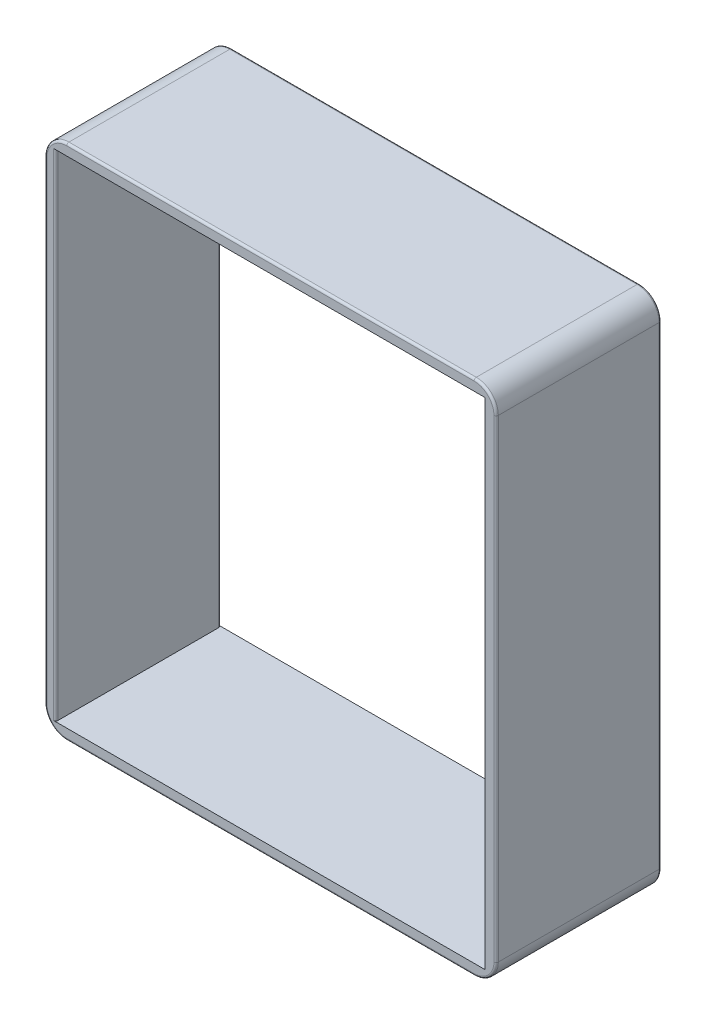
ISO-10303-21;
HEADER;
FILE_DESCRIPTION(('STEP AP214'),'2;1');
FILE_NAME('part.step','',(''),(''),'','','');
FILE_SCHEMA(('AUTOMOTIVE_DESIGN { 1 0 10303 214 1 1 1 1 }'));
ENDSEC;
DATA;
#1=APPLICATION_CONTEXT('core data for automotive mechanical design processes');
#2=APPLICATION_PROTOCOL_DEFINITION('international standard','automotive_design',2000,#1);
#3=PRODUCT_CONTEXT('',#1,'mechanical');
#4=PRODUCT('Part','Part','',(#3));
#5=PRODUCT_RELATED_PRODUCT_CATEGORY('part','',(#4));
#6=PRODUCT_DEFINITION_FORMATION('','',#4);
#7=PRODUCT_DEFINITION_CONTEXT('part definition',#1,'design');
#8=PRODUCT_DEFINITION('design','',#6,#7);
#9=PRODUCT_DEFINITION_SHAPE('','',#8);
#10=(LENGTH_UNIT() NAMED_UNIT(*) SI_UNIT(.MILLI.,.METRE.));
#11=(NAMED_UNIT(*) PLANE_ANGLE_UNIT() SI_UNIT($,.RADIAN.));
#12=(NAMED_UNIT(*) SI_UNIT($,.STERADIAN.) SOLID_ANGLE_UNIT());
#13=UNCERTAINTY_MEASURE_WITH_UNIT(LENGTH_MEASURE(1.E-05),#10,'distance_accuracy_value','');
#14=(GEOMETRIC_REPRESENTATION_CONTEXT(3) GLOBAL_UNCERTAINTY_ASSIGNED_CONTEXT((#13)) GLOBAL_UNIT_ASSIGNED_CONTEXT((#10,
#11,#12)) REPRESENTATION_CONTEXT('',''));
#15=CARTESIAN_POINT('',(0.,0.,0.));
#16=DIRECTION('',(0.,0.,1.));
#17=DIRECTION('',(1.,0.,0.));
#18=AXIS2_PLACEMENT_3D('',#15,#16,#17);
#19=CARTESIAN_POINT('',(0.,0.,15.));
#20=DIRECTION('',(0.,0.,1.));
#21=DIRECTION('',(1.,0.,0.));
#22=AXIS2_PLACEMENT_3D('',#19,#20,#21);
#23=PLANE('',#22);
#24=DIRECTION('',(-1.,0.,0.));
#25=VECTOR('',#24,1.);
#26=CARTESIAN_POINT('',(-18.5,23.3,15.));
#27=LINE('',#26,#25);
#28=CARTESIAN_POINT('',(18.5,23.3,15.));
#29=VERTEX_POINT('',#28);
#30=CARTESIAN_POINT('',(-18.5,23.3,15.));
#31=VERTEX_POINT('',#30);
#32=EDGE_CURVE('E267',#29,#31,#27,.T.);
#33=ORIENTED_EDGE('',*,*,#32,.T.);
#34=CARTESIAN_POINT('',(-18.5,21.5,15.));
#35=DIRECTION('',(0.,0.,1.));
#36=DIRECTION('',(1.,0.,0.));
#37=AXIS2_PLACEMENT_3D('',#34,#35,#36);
#38=CIRCLE('',#37,1.8);
#39=CARTESIAN_POINT('',(-20.3,21.5,15.));
#40=VERTEX_POINT('',#39);
#41=EDGE_CURVE('E269',#31,#40,#38,.T.);
#42=ORIENTED_EDGE('',*,*,#41,.T.);
#43=DIRECTION('',(0.,-1.,0.));
#44=VECTOR('',#43,1.);
#45=CARTESIAN_POINT('',(-20.3,-21.5,15.));
#46=LINE('',#45,#44);
#47=CARTESIAN_POINT('',(-20.3,-21.5,15.));
#48=VERTEX_POINT('',#47);
#49=EDGE_CURVE('E255',#40,#48,#46,.T.);
#50=ORIENTED_EDGE('',*,*,#49,.T.);
#51=CARTESIAN_POINT('',(-18.5,-21.5,15.));
#52=DIRECTION('',(0.,0.,1.));
#53=DIRECTION('',(1.,0.,0.));
#54=AXIS2_PLACEMENT_3D('',#51,#52,#53);
#55=CIRCLE('',#54,1.8);
#56=CARTESIAN_POINT('',(-18.5,-23.3,15.));
#57=VERTEX_POINT('',#56);
#58=EDGE_CURVE('E257',#48,#57,#55,.T.);
#59=ORIENTED_EDGE('',*,*,#58,.T.);
#60=DIRECTION('',(1.,0.,0.));
#61=VECTOR('',#60,1.);
#62=CARTESIAN_POINT('',(18.5,-23.3,15.));
#63=LINE('',#62,#61);
#64=CARTESIAN_POINT('',(18.5,-23.3,15.));
#65=VERTEX_POINT('',#64);
#66=EDGE_CURVE('E259',#57,#65,#63,.T.);
#67=ORIENTED_EDGE('',*,*,#66,.T.);
#68=CARTESIAN_POINT('',(18.5,-21.5,15.));
#69=DIRECTION('',(0.,0.,1.));
#70=DIRECTION('',(1.,0.,0.));
#71=AXIS2_PLACEMENT_3D('',#68,#69,#70);
#72=CIRCLE('',#71,1.8);
#73=CARTESIAN_POINT('',(20.3,-21.5,15.));
#74=VERTEX_POINT('',#73);
#75=EDGE_CURVE('E261',#65,#74,#72,.T.);
#76=ORIENTED_EDGE('',*,*,#75,.T.);
#77=DIRECTION('',(0.,1.,0.));
#78=VECTOR('',#77,1.);
#79=CARTESIAN_POINT('',(20.3,21.5,15.));
#80=LINE('',#79,#78);
#81=CARTESIAN_POINT('',(20.3,21.5,15.));
#82=VERTEX_POINT('',#81);
#83=EDGE_CURVE('E263',#74,#82,#80,.T.);
#84=ORIENTED_EDGE('',*,*,#83,.T.);
#85=CARTESIAN_POINT('',(18.5,21.5,15.));
#86=DIRECTION('',(0.,0.,1.));
#87=DIRECTION('',(1.,0.,0.));
#88=AXIS2_PLACEMENT_3D('',#85,#86,#87);
#89=CIRCLE('',#88,1.8);
#90=EDGE_CURVE('E265',#82,#29,#89,.T.);
#91=ORIENTED_EDGE('',*,*,#90,.T.);
#92=EDGE_LOOP('',(#33,#42,#50,#59,#67,#76,#84,#91));
#93=FACE_BOUND('',#92,.T.);
#94=DIRECTION('',(1.,0.,0.));
#95=VECTOR('',#94,1.);
#96=CARTESIAN_POINT('',(-19.5,-22.5,15.));
#97=LINE('',#96,#95);
#98=CARTESIAN_POINT('',(-19.7,-22.5,15.));
#99=VERTEX_POINT('',#98);
#100=CARTESIAN_POINT('',(19.5,-22.5,15.));
#101=VERTEX_POINT('',#100);
#102=EDGE_CURVE('E216',#99,#101,#97,.T.);
#103=ORIENTED_EDGE('',*,*,#102,.F.);
#104=DIRECTION('',(0.,-1.,0.));
#105=VECTOR('',#104,1.);
#106=CARTESIAN_POINT('',(-19.7,0.,15.));
#107=LINE('',#106,#105);
#108=CARTESIAN_POINT('',(-19.7,22.5,15.));
#109=VERTEX_POINT('',#108);
#110=EDGE_CURVE('E214',#99,#109,#107,.F.);
#111=ORIENTED_EDGE('',*,*,#110,.T.);
#112=DIRECTION('',(-1.,0.,0.));
#113=VECTOR('',#112,1.);
#114=CARTESIAN_POINT('',(-19.5,22.5,15.));
#115=LINE('',#114,#113);
#116=CARTESIAN_POINT('',(19.5,22.5,15.));
#117=VERTEX_POINT('',#116);
#118=EDGE_CURVE('E203',#117,#109,#115,.T.);
#119=ORIENTED_EDGE('',*,*,#118,.F.);
#120=DIRECTION('',(0.,1.,0.));
#121=VECTOR('',#120,1.);
#122=CARTESIAN_POINT('',(19.5,-22.5,15.));
#123=LINE('',#122,#121);
#124=EDGE_CURVE('E194',#101,#117,#123,.T.);
#125=ORIENTED_EDGE('',*,*,#124,.F.);
#126=EDGE_LOOP('',(#103,#111,#119,#125));
#127=FACE_BOUND('',#126,.T.);
#128=ADVANCED_FACE('F41',(#93,#127),#23,.T.);
#129=CARTESIAN_POINT('',(0.,0.,0.));
#130=DIRECTION('',(0.,0.,1.));
#131=DIRECTION('',(1.,0.,0.));
#132=AXIS2_PLACEMENT_3D('',#129,#130,#131);
#133=PLANE('',#132);
#134=DIRECTION('',(0.,-1.,0.));
#135=VECTOR('',#134,1.);
#136=CARTESIAN_POINT('',(-20.3,0.,0.));
#137=LINE('',#136,#135);
#138=CARTESIAN_POINT('',(-20.3,-21.5,0.));
#139=VERTEX_POINT('',#138);
#140=CARTESIAN_POINT('',(-20.3,21.5,0.));
#141=VERTEX_POINT('',#140);
#142=EDGE_CURVE('E305',#139,#141,#137,.F.);
#143=ORIENTED_EDGE('',*,*,#142,.T.);
#144=CARTESIAN_POINT('',(-18.5,21.5,0.));
#145=DIRECTION('',(0.,0.,1.));
#146=DIRECTION('',(1.,0.,0.));
#147=AXIS2_PLACEMENT_3D('',#144,#145,#146);
#148=CIRCLE('',#147,1.8);
#149=CARTESIAN_POINT('',(-18.5,23.3,0.));
#150=VERTEX_POINT('',#149);
#151=EDGE_CURVE('E319',#141,#150,#148,.F.);
#152=ORIENTED_EDGE('',*,*,#151,.T.);
#153=DIRECTION('',(-1.,0.,0.));
#154=VECTOR('',#153,1.);
#155=CARTESIAN_POINT('',(0.,23.3,0.));
#156=LINE('',#155,#154);
#157=CARTESIAN_POINT('',(18.5,23.3,0.));
#158=VERTEX_POINT('',#157);
#159=EDGE_CURVE('E317',#150,#158,#156,.F.);
#160=ORIENTED_EDGE('',*,*,#159,.T.);
#161=CARTESIAN_POINT('',(18.5,21.5,0.));
#162=DIRECTION('',(0.,0.,1.));
#163=DIRECTION('',(1.,0.,0.));
#164=AXIS2_PLACEMENT_3D('',#161,#162,#163);
#165=CIRCLE('',#164,1.8);
#166=CARTESIAN_POINT('',(20.3,21.5,0.));
#167=VERTEX_POINT('',#166);
#168=EDGE_CURVE('E315',#158,#167,#165,.F.);
#169=ORIENTED_EDGE('',*,*,#168,.T.);
#170=DIRECTION('',(0.,1.,0.));
#171=VECTOR('',#170,1.);
#172=CARTESIAN_POINT('',(20.3,0.,0.));
#173=LINE('',#172,#171);
#174=CARTESIAN_POINT('',(20.3,-21.5,0.));
#175=VERTEX_POINT('',#174);
#176=EDGE_CURVE('E313',#167,#175,#173,.F.);
#177=ORIENTED_EDGE('',*,*,#176,.T.);
#178=CARTESIAN_POINT('',(18.5,-21.5,0.));
#179=DIRECTION('',(0.,0.,1.));
#180=DIRECTION('',(1.,0.,0.));
#181=AXIS2_PLACEMENT_3D('',#178,#179,#180);
#182=CIRCLE('',#181,1.8);
#183=CARTESIAN_POINT('',(18.5,-23.3,0.));
#184=VERTEX_POINT('',#183);
#185=EDGE_CURVE('E311',#175,#184,#182,.F.);
#186=ORIENTED_EDGE('',*,*,#185,.T.);
#187=DIRECTION('',(1.,0.,0.));
#188=VECTOR('',#187,1.);
#189=CARTESIAN_POINT('',(0.,-23.3,0.));
#190=LINE('',#189,#188);
#191=CARTESIAN_POINT('',(-18.5,-23.3,0.));
#192=VERTEX_POINT('',#191);
#193=EDGE_CURVE('E309',#184,#192,#190,.F.);
#194=ORIENTED_EDGE('',*,*,#193,.T.);
#195=CARTESIAN_POINT('',(-18.5,-21.5,0.));
#196=DIRECTION('',(0.,0.,1.));
#197=DIRECTION('',(1.,0.,0.));
#198=AXIS2_PLACEMENT_3D('',#195,#196,#197);
#199=CIRCLE('',#198,1.8);
#200=EDGE_CURVE('E307',#192,#139,#199,.F.);
#201=ORIENTED_EDGE('',*,*,#200,.T.);
#202=EDGE_LOOP('',(#143,#152,#160,#169,#177,#186,#194,#201));
#203=FACE_BOUND('',#202,.T.);
#204=DIRECTION('',(0.,-1.,0.));
#205=VECTOR('',#204,1.);
#206=CARTESIAN_POINT('',(-19.7,-22.5,0.));
#207=LINE('',#206,#205);
#208=CARTESIAN_POINT('',(-19.7,22.5,0.));
#209=VERTEX_POINT('',#208);
#210=CARTESIAN_POINT('',(-19.7,-22.5,0.));
#211=VERTEX_POINT('',#210);
#212=EDGE_CURVE('E302',#209,#211,#207,.T.);
#213=ORIENTED_EDGE('',*,*,#212,.T.);
#214=DIRECTION('',(1.,0.,0.));
#215=VECTOR('',#214,1.);
#216=CARTESIAN_POINT('',(-19.5,-22.5,0.));
#217=LINE('',#216,#215);
#218=CARTESIAN_POINT('',(19.5,-22.5,0.));
#219=VERTEX_POINT('',#218);
#220=EDGE_CURVE('E204',#211,#219,#217,.T.);
#221=ORIENTED_EDGE('',*,*,#220,.T.);
#222=DIRECTION('',(0.,1.,0.));
#223=VECTOR('',#222,1.);
#224=CARTESIAN_POINT('',(19.5,-22.5,0.));
#225=LINE('',#224,#223);
#226=CARTESIAN_POINT('',(19.5,22.5,0.));
#227=VERTEX_POINT('',#226);
#228=EDGE_CURVE('E220',#219,#227,#225,.T.);
#229=ORIENTED_EDGE('',*,*,#228,.T.);
#230=DIRECTION('',(-1.,0.,0.));
#231=VECTOR('',#230,1.);
#232=CARTESIAN_POINT('',(-19.5,22.5,0.));
#233=LINE('',#232,#231);
#234=EDGE_CURVE('E210',#227,#209,#233,.T.);
#235=ORIENTED_EDGE('',*,*,#234,.T.);
#236=EDGE_LOOP('',(#213,#221,#229,#235));
#237=FACE_BOUND('',#236,.T.);
#238=ADVANCED_FACE('F478',(#203,#237),#133,.F.);
#239=CARTESIAN_POINT('',(-20.5,-23.5,15.));
#240=DIRECTION('',(0.,1.,0.));
#241=DIRECTION('',(0.,0.,1.));
#242=AXIS2_PLACEMENT_3D('',#239,#240,#241);
#243=PLANE('',#242);
#244=DIRECTION('',(0.,0.,-1.));
#245=VECTOR('',#244,1.);
#246=CARTESIAN_POINT('',(18.5,-23.5,15.));
#247=LINE('',#246,#245);
#248=CARTESIAN_POINT('',(18.5,-23.5,0.200000000000001));
#249=VERTEX_POINT('',#248);
#250=CARTESIAN_POINT('',(18.5,-23.5,14.8));
#251=VERTEX_POINT('',#250);
#252=EDGE_CURVE('E211',#249,#251,#247,.F.);
#253=ORIENTED_EDGE('',*,*,#252,.T.);
#254=DIRECTION('',(1.,0.,0.));
#255=VECTOR('',#254,1.);
#256=CARTESIAN_POINT('',(-18.5,-23.5,14.8));
#257=LINE('',#256,#255);
#258=CARTESIAN_POINT('',(-18.5,-23.5,14.8));
#259=VERTEX_POINT('',#258);
#260=EDGE_CURVE('E296',#251,#259,#257,.F.);
#261=ORIENTED_EDGE('',*,*,#260,.T.);
#262=DIRECTION('',(0.,0.,-1.));
#263=VECTOR('',#262,1.);
#264=CARTESIAN_POINT('',(-18.5,-23.5,15.));
#265=LINE('',#264,#263);
#266=CARTESIAN_POINT('',(-18.5,-23.5,0.200000000000001));
#267=VERTEX_POINT('',#266);
#268=EDGE_CURVE('E233',#259,#267,#265,.T.);
#269=ORIENTED_EDGE('',*,*,#268,.T.);
#270=DIRECTION('',(1.,0.,0.));
#271=VECTOR('',#270,1.);
#272=CARTESIAN_POINT('',(-20.5,-23.5,0.200000000000001));
#273=LINE('',#272,#271);
#274=EDGE_CURVE('E294',#267,#249,#273,.T.);
#275=ORIENTED_EDGE('',*,*,#274,.T.);
#276=EDGE_LOOP('',(#253,#261,#269,#275));
#277=FACE_BOUND('',#276,.T.);
#278=ADVANCED_FACE('F416',(#277),#243,.F.);
#279=CARTESIAN_POINT('',(20.5,-23.5,15.));
#280=DIRECTION('',(-1.,0.,0.));
#281=DIRECTION('',(0.,0.,1.));
#282=AXIS2_PLACEMENT_3D('',#279,#280,#281);
#283=PLANE('',#282);
#284=DIRECTION('',(0.,0.,-1.));
#285=VECTOR('',#284,1.);
#286=CARTESIAN_POINT('',(20.5,21.5,15.));
#287=LINE('',#286,#285);
#288=CARTESIAN_POINT('',(20.5,21.5,0.200000000000001));
#289=VERTEX_POINT('',#288);
#290=CARTESIAN_POINT('',(20.5,21.5,14.8));
#291=VERTEX_POINT('',#290);
#292=EDGE_CURVE('E242',#289,#291,#287,.F.);
#293=ORIENTED_EDGE('',*,*,#292,.T.);
#294=DIRECTION('',(0.,1.,0.));
#295=VECTOR('',#294,1.);
#296=CARTESIAN_POINT('',(20.5,-21.5,14.8));
#297=LINE('',#296,#295);
#298=CARTESIAN_POINT('',(20.5,-21.5,14.8));
#299=VERTEX_POINT('',#298);
#300=EDGE_CURVE('E288',#291,#299,#297,.F.);
#301=ORIENTED_EDGE('',*,*,#300,.T.);
#302=DIRECTION('',(0.,0.,-1.));
#303=VECTOR('',#302,1.);
#304=CARTESIAN_POINT('',(20.5,-21.5,15.));
#305=LINE('',#304,#303);
#306=CARTESIAN_POINT('',(20.5,-21.5,0.200000000000001));
#307=VERTEX_POINT('',#306);
#308=EDGE_CURVE('E245',#299,#307,#305,.T.);
#309=ORIENTED_EDGE('',*,*,#308,.T.);
#310=DIRECTION('',(0.,1.,0.));
#311=VECTOR('',#310,1.);
#312=CARTESIAN_POINT('',(20.5,-23.5,0.200000000000001));
#313=LINE('',#312,#311);
#314=EDGE_CURVE('E286',#307,#289,#313,.T.);
#315=ORIENTED_EDGE('',*,*,#314,.T.);
#316=EDGE_LOOP('',(#293,#301,#309,#315));
#317=FACE_BOUND('',#316,.T.);
#318=ADVANCED_FACE('F393',(#317),#283,.F.);
#319=CARTESIAN_POINT('',(-20.5,23.5,15.));
#320=DIRECTION('',(0.,-1.,0.));
#321=DIRECTION('',(0.,0.,-1.));
#322=AXIS2_PLACEMENT_3D('',#319,#320,#321);
#323=PLANE('',#322);
#324=DIRECTION('',(0.,0.,-1.));
#325=VECTOR('',#324,1.);
#326=CARTESIAN_POINT('',(-18.5,23.5,15.));
#327=LINE('',#326,#325);
#328=CARTESIAN_POINT('',(-18.5,23.5,0.200000000000001));
#329=VERTEX_POINT('',#328);
#330=CARTESIAN_POINT('',(-18.5,23.5,14.8));
#331=VERTEX_POINT('',#330);
#332=EDGE_CURVE('E248',#329,#331,#327,.F.);
#333=ORIENTED_EDGE('',*,*,#332,.T.);
#334=DIRECTION('',(-1.,0.,0.));
#335=VECTOR('',#334,1.);
#336=CARTESIAN_POINT('',(18.5,23.5,14.8));
#337=LINE('',#336,#335);
#338=CARTESIAN_POINT('',(18.5,23.5,14.8));
#339=VERTEX_POINT('',#338);
#340=EDGE_CURVE('E280',#331,#339,#337,.F.);
#341=ORIENTED_EDGE('',*,*,#340,.T.);
#342=DIRECTION('',(0.,0.,-1.));
#343=VECTOR('',#342,1.);
#344=CARTESIAN_POINT('',(18.5,23.5,15.));
#345=LINE('',#344,#343);
#346=CARTESIAN_POINT('',(18.5,23.5,0.200000000000001));
#347=VERTEX_POINT('',#346);
#348=EDGE_CURVE('E251',#339,#347,#345,.T.);
#349=ORIENTED_EDGE('',*,*,#348,.T.);
#350=DIRECTION('',(-1.,0.,0.));
#351=VECTOR('',#350,1.);
#352=CARTESIAN_POINT('',(-20.5,23.5,0.200000000000001));
#353=LINE('',#352,#351);
#354=EDGE_CURVE('E278',#347,#329,#353,.T.);
#355=ORIENTED_EDGE('',*,*,#354,.T.);
#356=EDGE_LOOP('',(#333,#341,#349,#355));
#357=FACE_BOUND('',#356,.T.);
#358=ADVANCED_FACE('F451',(#357),#323,.F.);
#359=CARTESIAN_POINT('',(-20.5,-23.5,15.));
#360=DIRECTION('',(1.,0.,0.));
#361=DIRECTION('',(0.,0.,-1.));
#362=AXIS2_PLACEMENT_3D('',#359,#360,#361);
#363=PLANE('',#362);
#364=DIRECTION('',(0.,0.,-1.));
#365=VECTOR('',#364,1.);
#366=CARTESIAN_POINT('',(-20.5,-21.5,15.));
#367=LINE('',#366,#365);
#368=CARTESIAN_POINT('',(-20.5,-21.5,0.200000000000001));
#369=VERTEX_POINT('',#368);
#370=CARTESIAN_POINT('',(-20.5,-21.5,14.8));
#371=VERTEX_POINT('',#370);
#372=EDGE_CURVE('E239',#369,#371,#367,.F.);
#373=ORIENTED_EDGE('',*,*,#372,.T.);
#374=DIRECTION('',(0.,-1.,0.));
#375=VECTOR('',#374,1.);
#376=CARTESIAN_POINT('',(-20.5,21.5,14.8));
#377=LINE('',#376,#375);
#378=CARTESIAN_POINT('',(-20.5,21.5,14.8));
#379=VERTEX_POINT('',#378);
#380=EDGE_CURVE('E324',#371,#379,#377,.F.);
#381=ORIENTED_EDGE('',*,*,#380,.T.);
#382=DIRECTION('',(0.,0.,-1.));
#383=VECTOR('',#382,1.);
#384=CARTESIAN_POINT('',(-20.5,21.5,15.));
#385=LINE('',#384,#383);
#386=CARTESIAN_POINT('',(-20.5,21.5,0.200000000000001));
#387=VERTEX_POINT('',#386);
#388=EDGE_CURVE('E236',#379,#387,#385,.T.);
#389=ORIENTED_EDGE('',*,*,#388,.T.);
#390=DIRECTION('',(0.,-1.,0.));
#391=VECTOR('',#390,1.);
#392=CARTESIAN_POINT('',(-20.5,-23.5,0.200000000000001));
#393=LINE('',#392,#391);
#394=EDGE_CURVE('E322',#387,#369,#393,.T.);
#395=ORIENTED_EDGE('',*,*,#394,.T.);
#396=EDGE_LOOP('',(#373,#381,#389,#395));
#397=FACE_BOUND('',#396,.T.);
#398=ADVANCED_FACE('F437',(#397),#363,.F.);
#399=CARTESIAN_POINT('',(19.5,-22.5,15.));
#400=DIRECTION('',(-1.,0.,0.));
#401=DIRECTION('',(0.,0.,1.));
#402=AXIS2_PLACEMENT_3D('',#399,#400,#401);
#403=PLANE('',#402);
#404=ORIENTED_EDGE('',*,*,#228,.F.);
#405=DIRECTION('',(0.,0.,-1.));
#406=VECTOR('',#405,1.);
#407=CARTESIAN_POINT('',(19.5,-22.5,15.));
#408=LINE('',#407,#406);
#409=EDGE_CURVE('E200',#101,#219,#408,.T.);
#410=ORIENTED_EDGE('',*,*,#409,.F.);
#411=ORIENTED_EDGE('',*,*,#124,.T.);
#412=DIRECTION('',(0.,0.,-1.));
#413=VECTOR('',#412,1.);
#414=CARTESIAN_POINT('',(19.5,22.5,15.));
#415=LINE('',#414,#413);
#416=EDGE_CURVE('E197',#117,#227,#415,.T.);
#417=ORIENTED_EDGE('',*,*,#416,.T.);
#418=EDGE_LOOP('',(#404,#410,#411,#417));
#419=FACE_BOUND('',#418,.T.);
#420=ADVANCED_FACE('F196',(#419),#403,.T.);
#421=CARTESIAN_POINT('',(-19.5,22.5,15.));
#422=DIRECTION('',(0.,-1.,0.));
#423=DIRECTION('',(0.,0.,-1.));
#424=AXIS2_PLACEMENT_3D('',#421,#422,#423);
#425=PLANE('',#424);
#426=ORIENTED_EDGE('',*,*,#234,.F.);
#427=ORIENTED_EDGE('',*,*,#416,.F.);
#428=ORIENTED_EDGE('',*,*,#118,.T.);
#429=CARTESIAN_POINT('',(-19.7,22.5,14.8));
#430=DIRECTION('',(0.,-1.,0.));
#431=DIRECTION('',(0.,0.,-1.));
#432=AXIS2_PLACEMENT_3D('',#429,#430,#431);
#433=CIRCLE('',#432,0.2);
#434=CARTESIAN_POINT('',(-19.5,22.5,14.8));
#435=VERTEX_POINT('',#434);
#436=EDGE_CURVE('E11',#109,#435,#433,.F.);
#437=ORIENTED_EDGE('',*,*,#436,.T.);
#438=DIRECTION('',(0.,0.,-1.));
#439=VECTOR('',#438,1.);
#440=CARTESIAN_POINT('',(-19.5,22.5,15.));
#441=LINE('',#440,#439);
#442=CARTESIAN_POINT('',(-19.5,22.5,0.200000000000001));
#443=VERTEX_POINT('',#442);
#444=EDGE_CURVE('E212',#435,#443,#441,.T.);
#445=ORIENTED_EDGE('',*,*,#444,.T.);
#446=CARTESIAN_POINT('',(-19.7,22.5,0.2));
#447=DIRECTION('',(0.,-1.,0.));
#448=DIRECTION('',(0.,0.,-1.));
#449=AXIS2_PLACEMENT_3D('',#446,#447,#448);
#450=CIRCLE('',#449,0.2);
#451=EDGE_CURVE('E331',#443,#209,#450,.F.);
#452=ORIENTED_EDGE('',*,*,#451,.T.);
#453=EDGE_LOOP('',(#426,#427,#428,#437,#445,#452));
#454=FACE_BOUND('',#453,.T.);
#455=ADVANCED_FACE('F207',(#454),#425,.T.);
#456=CARTESIAN_POINT('',(-19.5,-22.5,15.));
#457=DIRECTION('',(1.,0.,0.));
#458=DIRECTION('',(0.,0.,-1.));
#459=AXIS2_PLACEMENT_3D('',#456,#457,#458);
#460=PLANE('',#459);
#461=DIRECTION('',(0.,0.,-1.));
#462=VECTOR('',#461,1.);
#463=CARTESIAN_POINT('',(-19.5,-22.5,15.));
#464=LINE('',#463,#462);
#465=CARTESIAN_POINT('',(-19.5,-22.5,14.8));
#466=VERTEX_POINT('',#465);
#467=CARTESIAN_POINT('',(-19.5,-22.5,0.200000000000001));
#468=VERTEX_POINT('',#467);
#469=EDGE_CURVE('E227',#466,#468,#464,.T.);
#470=ORIENTED_EDGE('',*,*,#469,.T.);
#471=DIRECTION('',(0.,-1.,0.));
#472=VECTOR('',#471,1.);
#473=CARTESIAN_POINT('',(-19.5,22.5,0.2));
#474=LINE('',#473,#472);
#475=EDGE_CURVE('E328',#468,#443,#474,.F.);
#476=ORIENTED_EDGE('',*,*,#475,.T.);
#477=ORIENTED_EDGE('',*,*,#444,.F.);
#478=DIRECTION('',(0.,-1.,0.));
#479=VECTOR('',#478,1.);
#480=CARTESIAN_POINT('',(-19.5,-22.5,14.8));
#481=LINE('',#480,#479);
#482=EDGE_CURVE('E326',#435,#466,#481,.T.);
#483=ORIENTED_EDGE('',*,*,#482,.T.);
#484=EDGE_LOOP('',(#470,#476,#477,#483));
#485=FACE_BOUND('',#484,.T.);
#486=ADVANCED_FACE('F711',(#485),#460,.T.);
#487=CARTESIAN_POINT('',(-19.5,-22.5,15.));
#488=DIRECTION('',(0.,1.,0.));
#489=DIRECTION('',(0.,0.,1.));
#490=AXIS2_PLACEMENT_3D('',#487,#488,#489);
#491=PLANE('',#490);
#492=ORIENTED_EDGE('',*,*,#220,.F.);
#493=CARTESIAN_POINT('',(-19.7,-22.5,0.2));
#494=DIRECTION('',(0.,1.,0.));
#495=DIRECTION('',(0.,0.,1.));
#496=AXIS2_PLACEMENT_3D('',#493,#494,#495);
#497=CIRCLE('',#496,0.2);
#498=EDGE_CURVE('E58',#211,#468,#497,.F.);
#499=ORIENTED_EDGE('',*,*,#498,.T.);
#500=ORIENTED_EDGE('',*,*,#469,.F.);
#501=CARTESIAN_POINT('',(-19.7,-22.5,14.8));
#502=DIRECTION('',(0.,1.,0.));
#503=DIRECTION('',(0.,0.,1.));
#504=AXIS2_PLACEMENT_3D('',#501,#502,#503);
#505=CIRCLE('',#504,0.2);
#506=EDGE_CURVE('E50',#466,#99,#505,.F.);
#507=ORIENTED_EDGE('',*,*,#506,.T.);
#508=ORIENTED_EDGE('',*,*,#102,.T.);
#509=ORIENTED_EDGE('',*,*,#409,.T.);
#510=EDGE_LOOP('',(#492,#499,#500,#507,#508,#509));
#511=FACE_BOUND('',#510,.T.);
#512=ADVANCED_FACE('F508',(#511),#491,.T.);
#513=CARTESIAN_POINT('',(-18.5,-21.5,15.));
#514=DIRECTION('',(0.,0.,-1.));
#515=DIRECTION('',(-1.,0.,0.));
#516=AXIS2_PLACEMENT_3D('',#513,#514,#515);
#517=CYLINDRICAL_SURFACE('',#516,2.);
#518=ORIENTED_EDGE('',*,*,#268,.F.);
#519=CARTESIAN_POINT('',(-18.5,-21.5,14.8));
#520=DIRECTION('',(0.,0.,1.));
#521=DIRECTION('',(1.,0.,0.));
#522=AXIS2_PLACEMENT_3D('',#519,#520,#521);
#523=CIRCLE('',#522,2.);
#524=EDGE_CURVE('E300',#259,#371,#523,.F.);
#525=ORIENTED_EDGE('',*,*,#524,.T.);
#526=ORIENTED_EDGE('',*,*,#372,.F.);
#527=CARTESIAN_POINT('',(-18.5,-21.5,0.200000000000001));
#528=DIRECTION('',(0.,0.,1.));
#529=DIRECTION('',(1.,0.,0.));
#530=AXIS2_PLACEMENT_3D('',#527,#528,#529);
#531=CIRCLE('',#530,2.);
#532=EDGE_CURVE('E298',#369,#267,#531,.T.);
#533=ORIENTED_EDGE('',*,*,#532,.T.);
#534=EDGE_LOOP('',(#518,#525,#526,#533));
#535=FACE_BOUND('',#534,.T.);
#536=ADVANCED_FACE('F420',(#535),#517,.T.);
#537=CARTESIAN_POINT('',(18.5,-21.5,15.));
#538=DIRECTION('',(0.,0.,-1.));
#539=DIRECTION('',(-1.,0.,0.));
#540=AXIS2_PLACEMENT_3D('',#537,#538,#539);
#541=CYLINDRICAL_SURFACE('',#540,2.);
#542=ORIENTED_EDGE('',*,*,#308,.F.);
#543=CARTESIAN_POINT('',(18.5,-21.5,14.8));
#544=DIRECTION('',(0.,0.,1.));
#545=DIRECTION('',(1.,0.,0.));
#546=AXIS2_PLACEMENT_3D('',#543,#544,#545);
#547=CIRCLE('',#546,2.);
#548=EDGE_CURVE('E292',#299,#251,#547,.F.);
#549=ORIENTED_EDGE('',*,*,#548,.T.);
#550=ORIENTED_EDGE('',*,*,#252,.F.);
#551=CARTESIAN_POINT('',(18.5,-21.5,0.200000000000001));
#552=DIRECTION('',(0.,0.,1.));
#553=DIRECTION('',(1.,0.,0.));
#554=AXIS2_PLACEMENT_3D('',#551,#552,#553);
#555=CIRCLE('',#554,2.);
#556=EDGE_CURVE('E290',#249,#307,#555,.T.);
#557=ORIENTED_EDGE('',*,*,#556,.T.);
#558=EDGE_LOOP('',(#542,#549,#550,#557));
#559=FACE_BOUND('',#558,.T.);
#560=ADVANCED_FACE('F390',(#559),#541,.T.);
#561=CARTESIAN_POINT('',(18.5,21.5,15.));
#562=DIRECTION('',(0.,0.,-1.));
#563=DIRECTION('',(-1.,0.,0.));
#564=AXIS2_PLACEMENT_3D('',#561,#562,#563);
#565=CYLINDRICAL_SURFACE('',#564,2.);
#566=ORIENTED_EDGE('',*,*,#348,.F.);
#567=CARTESIAN_POINT('',(18.5,21.5,14.8));
#568=DIRECTION('',(0.,0.,1.));
#569=DIRECTION('',(1.,0.,0.));
#570=AXIS2_PLACEMENT_3D('',#567,#568,#569);
#571=CIRCLE('',#570,2.);
#572=EDGE_CURVE('E284',#339,#291,#571,.F.);
#573=ORIENTED_EDGE('',*,*,#572,.T.);
#574=ORIENTED_EDGE('',*,*,#292,.F.);
#575=CARTESIAN_POINT('',(18.5,21.5,0.200000000000001));
#576=DIRECTION('',(0.,0.,1.));
#577=DIRECTION('',(1.,0.,0.));
#578=AXIS2_PLACEMENT_3D('',#575,#576,#577);
#579=CIRCLE('',#578,2.);
#580=EDGE_CURVE('E282',#289,#347,#579,.T.);
#581=ORIENTED_EDGE('',*,*,#580,.T.);
#582=EDGE_LOOP('',(#566,#573,#574,#581));
#583=FACE_BOUND('',#582,.T.);
#584=ADVANCED_FACE('F454',(#583),#565,.T.);
#585=CARTESIAN_POINT('',(-18.5,21.5,15.));
#586=DIRECTION('',(0.,0.,-1.));
#587=DIRECTION('',(-1.,0.,0.));
#588=AXIS2_PLACEMENT_3D('',#585,#586,#587);
#589=CYLINDRICAL_SURFACE('',#588,2.);
#590=ORIENTED_EDGE('',*,*,#388,.F.);
#591=CARTESIAN_POINT('',(-18.5,21.5,14.8));
#592=DIRECTION('',(0.,0.,1.));
#593=DIRECTION('',(1.,0.,0.));
#594=AXIS2_PLACEMENT_3D('',#591,#592,#593);
#595=CIRCLE('',#594,2.);
#596=EDGE_CURVE('E275',#379,#331,#595,.F.);
#597=ORIENTED_EDGE('',*,*,#596,.T.);
#598=ORIENTED_EDGE('',*,*,#332,.F.);
#599=CARTESIAN_POINT('',(-18.5,21.5,0.200000000000001));
#600=DIRECTION('',(0.,0.,1.));
#601=DIRECTION('',(1.,0.,0.));
#602=AXIS2_PLACEMENT_3D('',#599,#600,#601);
#603=CIRCLE('',#602,2.);
#604=EDGE_CURVE('E272',#329,#387,#603,.T.);
#605=ORIENTED_EDGE('',*,*,#604,.T.);
#606=EDGE_LOOP('',(#590,#597,#598,#605));
#607=FACE_BOUND('',#606,.T.);
#608=ADVANCED_FACE('F440',(#607),#589,.T.);
#609=CARTESIAN_POINT('',(18.5,-21.5,14.8));
#610=DIRECTION('',(0.,0.,1.));
#611=DIRECTION('',(1.,0.,0.));
#612=AXIS2_PLACEMENT_3D('',#609,#610,#611);
#613=TOROIDAL_SURFACE('',#612,1.8,0.2);
#614=CARTESIAN_POINT('',(18.5,-23.3,14.8));
#615=DIRECTION('',(-1.,0.,0.));
#616=DIRECTION('',(0.,0.,1.));
#617=AXIS2_PLACEMENT_3D('',#614,#615,#616);
#618=CIRCLE('',#617,0.2);
#619=EDGE_CURVE('E350',#251,#65,#618,.T.);
#620=ORIENTED_EDGE('',*,*,#619,.F.);
#621=ORIENTED_EDGE('',*,*,#548,.F.);
#622=CARTESIAN_POINT('',(20.3,-21.5,14.8));
#623=DIRECTION('',(0.,1.,0.));
#624=DIRECTION('',(0.,0.,1.));
#625=AXIS2_PLACEMENT_3D('',#622,#623,#624);
#626=CIRCLE('',#625,0.2);
#627=EDGE_CURVE('E222',#74,#299,#626,.T.);
#628=ORIENTED_EDGE('',*,*,#627,.F.);
#629=ORIENTED_EDGE('',*,*,#75,.F.);
#630=EDGE_LOOP('',(#620,#621,#628,#629));
#631=FACE_BOUND('',#630,.T.);
#632=ADVANCED_FACE('F413',(#631),#613,.T.);
#633=CARTESIAN_POINT('',(20.3,0.,14.8));
#634=DIRECTION('',(0.,-1.,0.));
#635=DIRECTION('',(0.,0.,-1.));
#636=AXIS2_PLACEMENT_3D('',#633,#634,#635);
#637=CYLINDRICAL_SURFACE('',#636,0.2);
#638=ORIENTED_EDGE('',*,*,#627,.T.);
#639=ORIENTED_EDGE('',*,*,#300,.F.);
#640=CARTESIAN_POINT('',(20.3,21.5,14.8));
#641=DIRECTION('',(0.,1.,0.));
#642=DIRECTION('',(0.,0.,1.));
#643=AXIS2_PLACEMENT_3D('',#640,#641,#642);
#644=CIRCLE('',#643,0.2);
#645=EDGE_CURVE('E347',#82,#291,#644,.T.);
#646=ORIENTED_EDGE('',*,*,#645,.F.);
#647=ORIENTED_EDGE('',*,*,#83,.F.);
#648=EDGE_LOOP('',(#638,#639,#646,#647));
#649=FACE_BOUND('',#648,.T.);
#650=ADVANCED_FACE('F398',(#649),#637,.T.);
#651=CARTESIAN_POINT('',(0.,-23.3,14.8));
#652=DIRECTION('',(-1.,0.,0.));
#653=DIRECTION('',(0.,0.,1.));
#654=AXIS2_PLACEMENT_3D('',#651,#652,#653);
#655=CYLINDRICAL_SURFACE('',#654,0.2);
#656=ORIENTED_EDGE('',*,*,#619,.T.);
#657=ORIENTED_EDGE('',*,*,#66,.F.);
#658=CARTESIAN_POINT('',(-18.5,-23.3,14.8));
#659=DIRECTION('',(-1.,0.,0.));
#660=DIRECTION('',(0.,0.,1.));
#661=AXIS2_PLACEMENT_3D('',#658,#659,#660);
#662=CIRCLE('',#661,0.2);
#663=EDGE_CURVE('E344',#259,#57,#662,.T.);
#664=ORIENTED_EDGE('',*,*,#663,.F.);
#665=ORIENTED_EDGE('',*,*,#260,.F.);
#666=EDGE_LOOP('',(#656,#657,#664,#665));
#667=FACE_BOUND('',#666,.T.);
#668=ADVANCED_FACE('F425',(#667),#655,.T.);
#669=CARTESIAN_POINT('',(18.5,21.5,14.8));
#670=DIRECTION('',(0.,0.,1.));
#671=DIRECTION('',(1.,0.,0.));
#672=AXIS2_PLACEMENT_3D('',#669,#670,#671);
#673=TOROIDAL_SURFACE('',#672,1.8,0.2);
#674=ORIENTED_EDGE('',*,*,#645,.T.);
#675=ORIENTED_EDGE('',*,*,#572,.F.);
#676=CARTESIAN_POINT('',(18.5,23.3,14.8));
#677=DIRECTION('',(-1.,0.,0.));
#678=DIRECTION('',(0.,0.,1.));
#679=AXIS2_PLACEMENT_3D('',#676,#677,#678);
#680=CIRCLE('',#679,0.2);
#681=EDGE_CURVE('E341',#29,#339,#680,.T.);
#682=ORIENTED_EDGE('',*,*,#681,.F.);
#683=ORIENTED_EDGE('',*,*,#90,.F.);
#684=EDGE_LOOP('',(#674,#675,#682,#683));
#685=FACE_BOUND('',#684,.T.);
#686=ADVANCED_FACE('F404',(#685),#673,.T.);
#687=CARTESIAN_POINT('',(-18.5,-21.5,14.8));
#688=DIRECTION('',(0.,0.,1.));
#689=DIRECTION('',(1.,0.,0.));
#690=AXIS2_PLACEMENT_3D('',#687,#688,#689);
#691=TOROIDAL_SURFACE('',#690,1.8,0.2);
#692=ORIENTED_EDGE('',*,*,#663,.T.);
#693=ORIENTED_EDGE('',*,*,#58,.F.);
#694=CARTESIAN_POINT('',(-20.3,-21.5,14.8));
#695=DIRECTION('',(0.,1.,0.));
#696=DIRECTION('',(0.,0.,1.));
#697=AXIS2_PLACEMENT_3D('',#694,#695,#696);
#698=CIRCLE('',#697,0.2);
#699=EDGE_CURVE('E338',#371,#48,#698,.T.);
#700=ORIENTED_EDGE('',*,*,#699,.F.);
#701=ORIENTED_EDGE('',*,*,#524,.F.);
#702=EDGE_LOOP('',(#692,#693,#700,#701));
#703=FACE_BOUND('',#702,.T.);
#704=ADVANCED_FACE('F429',(#703),#691,.T.);
#705=CARTESIAN_POINT('',(0.,23.3,14.8));
#706=DIRECTION('',(1.,0.,0.));
#707=DIRECTION('',(0.,0.,-1.));
#708=AXIS2_PLACEMENT_3D('',#705,#706,#707);
#709=CYLINDRICAL_SURFACE('',#708,0.2);
#710=ORIENTED_EDGE('',*,*,#681,.T.);
#711=ORIENTED_EDGE('',*,*,#340,.F.);
#712=CARTESIAN_POINT('',(-18.5,23.3,14.8));
#713=DIRECTION('',(-1.,0.,0.));
#714=DIRECTION('',(0.,0.,1.));
#715=AXIS2_PLACEMENT_3D('',#712,#713,#714);
#716=CIRCLE('',#715,0.2);
#717=EDGE_CURVE('E336',#31,#331,#716,.T.);
#718=ORIENTED_EDGE('',*,*,#717,.F.);
#719=ORIENTED_EDGE('',*,*,#32,.F.);
#720=EDGE_LOOP('',(#710,#711,#718,#719));
#721=FACE_BOUND('',#720,.T.);
#722=ADVANCED_FACE('F448',(#721),#709,.T.);
#723=CARTESIAN_POINT('',(-20.3,0.,14.8));
#724=DIRECTION('',(0.,1.,0.));
#725=DIRECTION('',(0.,0.,1.));
#726=AXIS2_PLACEMENT_3D('',#723,#724,#725);
#727=CYLINDRICAL_SURFACE('',#726,0.2);
#728=ORIENTED_EDGE('',*,*,#699,.T.);
#729=ORIENTED_EDGE('',*,*,#49,.F.);
#730=CARTESIAN_POINT('',(-20.3,21.5,14.8));
#731=DIRECTION('',(0.,1.,0.));
#732=DIRECTION('',(0.,0.,1.));
#733=AXIS2_PLACEMENT_3D('',#730,#731,#732);
#734=CIRCLE('',#733,0.2);
#735=EDGE_CURVE('E334',#379,#40,#734,.T.);
#736=ORIENTED_EDGE('',*,*,#735,.F.);
#737=ORIENTED_EDGE('',*,*,#380,.F.);
#738=EDGE_LOOP('',(#728,#729,#736,#737));
#739=FACE_BOUND('',#738,.T.);
#740=ADVANCED_FACE('F434',(#739),#727,.T.);
#741=CARTESIAN_POINT('',(-18.5,21.5,14.8));
#742=DIRECTION('',(0.,0.,1.));
#743=DIRECTION('',(1.,0.,0.));
#744=AXIS2_PLACEMENT_3D('',#741,#742,#743);
#745=TOROIDAL_SURFACE('',#744,1.8,0.2);
#746=ORIENTED_EDGE('',*,*,#717,.T.);
#747=ORIENTED_EDGE('',*,*,#596,.F.);
#748=ORIENTED_EDGE('',*,*,#735,.T.);
#749=ORIENTED_EDGE('',*,*,#41,.F.);
#750=EDGE_LOOP('',(#746,#747,#748,#749));
#751=FACE_BOUND('',#750,.T.);
#752=ADVANCED_FACE('F444',(#751),#745,.T.);
#753=CARTESIAN_POINT('',(18.5,-21.5,0.200000000000001));
#754=DIRECTION('',(0.,0.,1.));
#755=DIRECTION('',(1.,0.,0.));
#756=AXIS2_PLACEMENT_3D('',#753,#754,#755);
#757=TOROIDAL_SURFACE('',#756,1.8,0.2);
#758=CARTESIAN_POINT('',(20.3,-21.5,0.200000000000001));
#759=DIRECTION('',(0.,1.,0.));
#760=DIRECTION('',(0.,0.,1.));
#761=AXIS2_PLACEMENT_3D('',#758,#759,#760);
#762=CIRCLE('',#761,0.2);
#763=EDGE_CURVE('E370',#307,#175,#762,.T.);
#764=ORIENTED_EDGE('',*,*,#763,.F.);
#765=ORIENTED_EDGE('',*,*,#556,.F.);
#766=CARTESIAN_POINT('',(18.5,-23.3,0.2));
#767=DIRECTION('',(-1.,0.,0.));
#768=DIRECTION('',(0.,0.,1.));
#769=AXIS2_PLACEMENT_3D('',#766,#767,#768);
#770=CIRCLE('',#769,0.2);
#771=EDGE_CURVE('E45',#184,#249,#770,.T.);
#772=ORIENTED_EDGE('',*,*,#771,.F.);
#773=ORIENTED_EDGE('',*,*,#185,.F.);
#774=EDGE_LOOP('',(#764,#765,#772,#773));
#775=FACE_BOUND('',#774,.T.);
#776=ADVANCED_FACE('F386',(#775),#757,.T.);
#777=CARTESIAN_POINT('',(-20.5,-23.3,0.200000000000001));
#778=DIRECTION('',(1.,0.,0.));
#779=DIRECTION('',(0.,0.,-1.));
#780=AXIS2_PLACEMENT_3D('',#777,#778,#779);
#781=CYLINDRICAL_SURFACE('',#780,0.2);
#782=ORIENTED_EDGE('',*,*,#771,.T.);
#783=ORIENTED_EDGE('',*,*,#274,.F.);
#784=CARTESIAN_POINT('',(-18.5,-23.3,0.2));
#785=DIRECTION('',(-1.,0.,0.));
#786=DIRECTION('',(0.,0.,1.));
#787=AXIS2_PLACEMENT_3D('',#784,#785,#786);
#788=CIRCLE('',#787,0.2);
#789=EDGE_CURVE('E368',#192,#267,#788,.T.);
#790=ORIENTED_EDGE('',*,*,#789,.F.);
#791=ORIENTED_EDGE('',*,*,#193,.F.);
#792=EDGE_LOOP('',(#782,#783,#790,#791));
#793=FACE_BOUND('',#792,.T.);
#794=ADVANCED_FACE('F381',(#793),#781,.T.);
#795=CARTESIAN_POINT('',(20.3,-23.5,0.200000000000001));
#796=DIRECTION('',(0.,1.,0.));
#797=DIRECTION('',(0.,0.,1.));
#798=AXIS2_PLACEMENT_3D('',#795,#796,#797);
#799=CYLINDRICAL_SURFACE('',#798,0.2);
#800=ORIENTED_EDGE('',*,*,#763,.T.);
#801=ORIENTED_EDGE('',*,*,#176,.F.);
#802=CARTESIAN_POINT('',(20.3,21.5,0.200000000000001));
#803=DIRECTION('',(0.,1.,0.));
#804=DIRECTION('',(0.,0.,1.));
#805=AXIS2_PLACEMENT_3D('',#802,#803,#804);
#806=CIRCLE('',#805,0.2);
#807=EDGE_CURVE('E365',#289,#167,#806,.T.);
#808=ORIENTED_EDGE('',*,*,#807,.F.);
#809=ORIENTED_EDGE('',*,*,#314,.F.);
#810=EDGE_LOOP('',(#800,#801,#808,#809));
#811=FACE_BOUND('',#810,.T.);
#812=ADVANCED_FACE('F480',(#811),#799,.T.);
#813=CARTESIAN_POINT('',(-18.5,-21.5,0.200000000000001));
#814=DIRECTION('',(0.,0.,1.));
#815=DIRECTION('',(1.,0.,0.));
#816=AXIS2_PLACEMENT_3D('',#813,#814,#815);
#817=TOROIDAL_SURFACE('',#816,1.8,0.2);
#818=ORIENTED_EDGE('',*,*,#789,.T.);
#819=ORIENTED_EDGE('',*,*,#532,.F.);
#820=CARTESIAN_POINT('',(-20.3,-21.5,0.2));
#821=DIRECTION('',(0.,1.,0.));
#822=DIRECTION('',(0.,0.,1.));
#823=AXIS2_PLACEMENT_3D('',#820,#821,#822);
#824=CIRCLE('',#823,0.2);
#825=EDGE_CURVE('E362',#139,#369,#824,.T.);
#826=ORIENTED_EDGE('',*,*,#825,.F.);
#827=ORIENTED_EDGE('',*,*,#200,.F.);
#828=EDGE_LOOP('',(#818,#819,#826,#827));
#829=FACE_BOUND('',#828,.T.);
#830=ADVANCED_FACE('F475',(#829),#817,.T.);
#831=CARTESIAN_POINT('',(18.5,21.5,0.200000000000001));
#832=DIRECTION('',(0.,0.,1.));
#833=DIRECTION('',(1.,0.,0.));
#834=AXIS2_PLACEMENT_3D('',#831,#832,#833);
#835=TOROIDAL_SURFACE('',#834,1.8,0.2);
#836=ORIENTED_EDGE('',*,*,#807,.T.);
#837=ORIENTED_EDGE('',*,*,#168,.F.);
#838=CARTESIAN_POINT('',(18.5,23.3,0.200000000000001));
#839=DIRECTION('',(-1.,0.,0.));
#840=DIRECTION('',(0.,0.,1.));
#841=AXIS2_PLACEMENT_3D('',#838,#839,#840);
#842=CIRCLE('',#841,0.2);
#843=EDGE_CURVE('E359',#347,#158,#842,.T.);
#844=ORIENTED_EDGE('',*,*,#843,.F.);
#845=ORIENTED_EDGE('',*,*,#580,.F.);
#846=EDGE_LOOP('',(#836,#837,#844,#845));
#847=FACE_BOUND('',#846,.T.);
#848=ADVANCED_FACE('F458',(#847),#835,.T.);
#849=CARTESIAN_POINT('',(-20.3,-23.5,0.200000000000001));
#850=DIRECTION('',(0.,-1.,0.));
#851=DIRECTION('',(0.,0.,-1.));
#852=AXIS2_PLACEMENT_3D('',#849,#850,#851);
#853=CYLINDRICAL_SURFACE('',#852,0.2);
#854=ORIENTED_EDGE('',*,*,#825,.T.);
#855=ORIENTED_EDGE('',*,*,#394,.F.);
#856=CARTESIAN_POINT('',(-20.3,21.5,0.2));
#857=DIRECTION('',(0.,1.,0.));
#858=DIRECTION('',(0.,0.,1.));
#859=AXIS2_PLACEMENT_3D('',#856,#857,#858);
#860=CIRCLE('',#859,0.2);
#861=EDGE_CURVE('E357',#141,#387,#860,.T.);
#862=ORIENTED_EDGE('',*,*,#861,.F.);
#863=ORIENTED_EDGE('',*,*,#142,.F.);
#864=EDGE_LOOP('',(#854,#855,#862,#863));
#865=FACE_BOUND('',#864,.T.);
#866=ADVANCED_FACE('F472',(#865),#853,.T.);
#867=CARTESIAN_POINT('',(-20.5,23.3,0.200000000000001));
#868=DIRECTION('',(-1.,0.,0.));
#869=DIRECTION('',(0.,0.,1.));
#870=AXIS2_PLACEMENT_3D('',#867,#868,#869);
#871=CYLINDRICAL_SURFACE('',#870,0.2);
#872=ORIENTED_EDGE('',*,*,#843,.T.);
#873=ORIENTED_EDGE('',*,*,#159,.F.);
#874=CARTESIAN_POINT('',(-18.5,23.3,0.200000000000001));
#875=DIRECTION('',(-1.,0.,0.));
#876=DIRECTION('',(0.,0.,1.));
#877=AXIS2_PLACEMENT_3D('',#874,#875,#876);
#878=CIRCLE('',#877,0.2);
#879=EDGE_CURVE('E355',#329,#150,#878,.T.);
#880=ORIENTED_EDGE('',*,*,#879,.F.);
#881=ORIENTED_EDGE('',*,*,#354,.F.);
#882=EDGE_LOOP('',(#872,#873,#880,#881));
#883=FACE_BOUND('',#882,.T.);
#884=ADVANCED_FACE('F464',(#883),#871,.T.);
#885=CARTESIAN_POINT('',(-18.5,21.5,0.200000000000001));
#886=DIRECTION('',(0.,0.,1.));
#887=DIRECTION('',(1.,0.,0.));
#888=AXIS2_PLACEMENT_3D('',#885,#886,#887);
#889=TOROIDAL_SURFACE('',#888,1.8,0.2);
#890=ORIENTED_EDGE('',*,*,#861,.T.);
#891=ORIENTED_EDGE('',*,*,#604,.F.);
#892=ORIENTED_EDGE('',*,*,#879,.T.);
#893=ORIENTED_EDGE('',*,*,#151,.F.);
#894=EDGE_LOOP('',(#890,#891,#892,#893));
#895=FACE_BOUND('',#894,.T.);
#896=ADVANCED_FACE('F466',(#895),#889,.T.);
#897=CARTESIAN_POINT('',(-19.7,0.,0.2));
#898=DIRECTION('',(0.,1.,0.));
#899=DIRECTION('',(0.,0.,1.));
#900=AXIS2_PLACEMENT_3D('',#897,#898,#899);
#901=CYLINDRICAL_SURFACE('',#900,0.2);
#902=ORIENTED_EDGE('',*,*,#451,.F.);
#903=ORIENTED_EDGE('',*,*,#475,.F.);
#904=ORIENTED_EDGE('',*,*,#498,.F.);
#905=ORIENTED_EDGE('',*,*,#212,.F.);
#906=EDGE_LOOP('',(#902,#903,#904,#905));
#907=FACE_BOUND('',#906,.T.);
#908=ADVANCED_FACE('F533',(#907),#901,.T.);
#909=CARTESIAN_POINT('',(-19.7,-22.5,14.8));
#910=DIRECTION('',(0.,-1.,0.));
#911=DIRECTION('',(0.,0.,-1.));
#912=AXIS2_PLACEMENT_3D('',#909,#910,#911);
#913=CYLINDRICAL_SURFACE('',#912,0.2);
#914=ORIENTED_EDGE('',*,*,#436,.F.);
#915=ORIENTED_EDGE('',*,*,#110,.F.);
#916=ORIENTED_EDGE('',*,*,#506,.F.);
#917=ORIENTED_EDGE('',*,*,#482,.F.);
#918=EDGE_LOOP('',(#914,#915,#916,#917));
#919=FACE_BOUND('',#918,.T.);
#920=ADVANCED_FACE('F43',(#919),#913,.T.);
#921=CLOSED_SHELL('',(#128,#238,#278,#318,#358,#398,#420,#455,#486,#512,#536,#560,#584,#608,
#632,#650,#668,#686,#704,#722,#740,#752,#776,#794,#812,#830,#848,#866,#884,#896,#908,#920));
#922=MANIFOLD_SOLID_BREP('B2',#921);
#923=ADVANCED_BREP_SHAPE_REPRESENTATION('',(#18,#922),#14);
#924=SHAPE_DEFINITION_REPRESENTATION(#9,#923);
ENDSEC;
END-ISO-10303-21;
